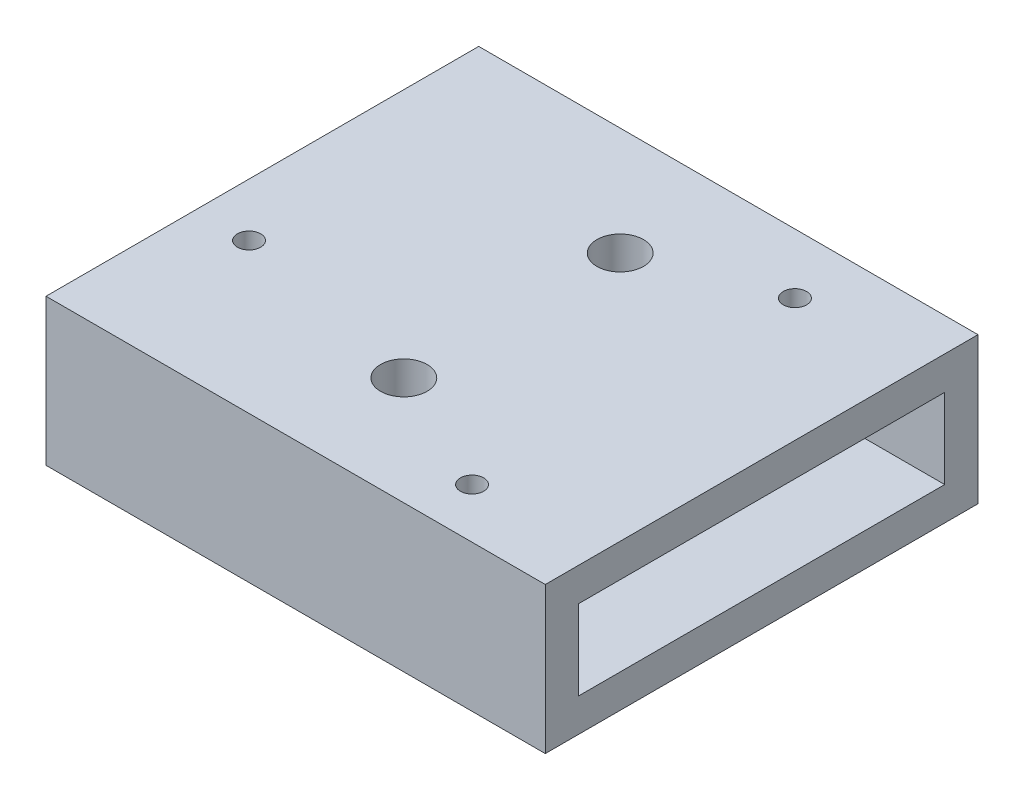
ISO-10303-21;
HEADER;
FILE_DESCRIPTION(('STEP AP214'),'2;1');
FILE_NAME('part.step','',(''),(''),'','','');
FILE_SCHEMA(('AUTOMOTIVE_DESIGN { 1 0 10303 214 1 1 1 1 }'));
ENDSEC;
DATA;
#1=APPLICATION_CONTEXT('core data for automotive mechanical design processes');
#2=APPLICATION_PROTOCOL_DEFINITION('international standard','automotive_design',2000,#1);
#3=PRODUCT_CONTEXT('',#1,'mechanical');
#4=PRODUCT('Part','Part','',(#3));
#5=PRODUCT_RELATED_PRODUCT_CATEGORY('part','',(#4));
#6=PRODUCT_DEFINITION_FORMATION('','',#4);
#7=PRODUCT_DEFINITION_CONTEXT('part definition',#1,'design');
#8=PRODUCT_DEFINITION('design','',#6,#7);
#9=PRODUCT_DEFINITION_SHAPE('','',#8);
#10=(LENGTH_UNIT() NAMED_UNIT(*) SI_UNIT(.MILLI.,.METRE.));
#11=(NAMED_UNIT(*) PLANE_ANGLE_UNIT() SI_UNIT($,.RADIAN.));
#12=(NAMED_UNIT(*) SI_UNIT($,.STERADIAN.) SOLID_ANGLE_UNIT());
#13=UNCERTAINTY_MEASURE_WITH_UNIT(LENGTH_MEASURE(1.E-05),#10,'distance_accuracy_value','');
#14=(GEOMETRIC_REPRESENTATION_CONTEXT(3) GLOBAL_UNCERTAINTY_ASSIGNED_CONTEXT((#13)) GLOBAL_UNIT_ASSIGNED_CONTEXT((#10,
#11,#12)) REPRESENTATION_CONTEXT('',''));
#15=CARTESIAN_POINT('',(0.,0.,0.));
#16=DIRECTION('',(0.,0.,1.));
#17=DIRECTION('',(1.,0.,0.));
#18=AXIS2_PLACEMENT_3D('',#15,#16,#17);
#19=CARTESIAN_POINT('',(-32.5,0.,0.));
#20=DIRECTION('',(1.,0.,0.));
#21=DIRECTION('',(0.,0.,-1.));
#22=AXIS2_PLACEMENT_3D('',#19,#20,#21);
#23=PLANE('',#22);
#24=DIRECTION('',(0.,-1.,0.));
#25=VECTOR('',#24,1.);
#26=CARTESIAN_POINT('',(-32.5,0.,-9.5));
#27=LINE('',#26,#25);
#28=CARTESIAN_POINT('',(-32.5,17.,-9.5));
#29=VERTEX_POINT('',#28);
#30=CARTESIAN_POINT('',(-32.5,5.,-9.5));
#31=VERTEX_POINT('',#30);
#32=EDGE_CURVE('E11',#29,#31,#27,.T.);
#33=ORIENTED_EDGE('',*,*,#32,.F.);
#34=DIRECTION('',(0.,0.,1.));
#35=VECTOR('',#34,1.);
#36=CARTESIAN_POINT('',(-32.5,17.,27.5));
#37=LINE('',#36,#35);
#38=CARTESIAN_POINT('',(-32.5,17.,27.5));
#39=VERTEX_POINT('',#38);
#40=EDGE_CURVE('E174',#29,#39,#37,.T.);
#41=ORIENTED_EDGE('',*,*,#40,.T.);
#42=DIRECTION('',(0.,-1.,0.));
#43=VECTOR('',#42,1.);
#44=CARTESIAN_POINT('',(-32.5,17.,27.5));
#45=LINE('',#44,#43);
#46=CARTESIAN_POINT('',(-32.5,5.,27.5));
#47=VERTEX_POINT('',#46);
#48=EDGE_CURVE('E179',#39,#47,#45,.T.);
#49=ORIENTED_EDGE('',*,*,#48,.T.);
#50=DIRECTION('',(0.,0.,-1.));
#51=VECTOR('',#50,1.);
#52=CARTESIAN_POINT('',(-32.5,5.,27.5));
#53=LINE('',#52,#51);
#54=EDGE_CURVE('E184',#47,#31,#53,.T.);
#55=ORIENTED_EDGE('',*,*,#54,.T.);
#56=EDGE_LOOP('',(#33,#41,#49,#55));
#57=FACE_BOUND('',#56,.T.);
#58=ADVANCED_FACE('F45',(#57),#23,.T.);
#59=CARTESIAN_POINT('',(-37.5,22.,-32.5));
#60=DIRECTION('',(1.,0.,0.));
#61=DIRECTION('',(0.,0.,-1.));
#62=AXIS2_PLACEMENT_3D('',#59,#60,#61);
#63=PLANE('',#62);
#64=DIRECTION('',(0.,0.,-1.));
#65=VECTOR('',#64,1.);
#66=CARTESIAN_POINT('',(-37.5,17.,-24.5));
#67=LINE('',#66,#65);
#68=CARTESIAN_POINT('',(-37.5,17.,-9.5));
#69=VERTEX_POINT('',#68);
#70=CARTESIAN_POINT('',(-37.5,17.,-24.5));
#71=VERTEX_POINT('',#70);
#72=EDGE_CURVE('E147',#69,#71,#67,.T.);
#73=ORIENTED_EDGE('',*,*,#72,.F.);
#74=DIRECTION('',(0.,1.,0.));
#75=VECTOR('',#74,1.);
#76=CARTESIAN_POINT('',(-37.5,17.,-9.5));
#77=LINE('',#76,#75);
#78=CARTESIAN_POINT('',(-37.5,5.,-9.5));
#79=VERTEX_POINT('',#78);
#80=EDGE_CURVE('E63',#79,#69,#77,.T.);
#81=ORIENTED_EDGE('',*,*,#80,.F.);
#82=DIRECTION('',(0.,0.,1.));
#83=VECTOR('',#82,1.);
#84=CARTESIAN_POINT('',(-37.5,5.,-24.5));
#85=LINE('',#84,#83);
#86=CARTESIAN_POINT('',(-37.5,5.,-24.5));
#87=VERTEX_POINT('',#86);
#88=EDGE_CURVE('E155',#87,#79,#85,.T.);
#89=ORIENTED_EDGE('',*,*,#88,.F.);
#90=DIRECTION('',(0.,-1.,0.));
#91=VECTOR('',#90,1.);
#92=CARTESIAN_POINT('',(-37.5,17.,-24.5));
#93=LINE('',#92,#91);
#94=EDGE_CURVE('E138',#71,#87,#93,.T.);
#95=ORIENTED_EDGE('',*,*,#94,.F.);
#96=EDGE_LOOP('',(#73,#81,#89,#95));
#97=FACE_BOUND('',#96,.T.);
#98=DIRECTION('',(0.,0.,1.));
#99=VECTOR('',#98,1.);
#100=CARTESIAN_POINT('',(-37.5,0.,-32.5));
#101=LINE('',#100,#99);
#102=CARTESIAN_POINT('',(-37.5,0.,-32.5));
#103=VERTEX_POINT('',#102);
#104=CARTESIAN_POINT('',(-37.5,0.,32.5));
#105=VERTEX_POINT('',#104);
#106=EDGE_CURVE('E204',#103,#105,#101,.T.);
#107=ORIENTED_EDGE('',*,*,#106,.T.);
#108=DIRECTION('',(0.,-1.,0.));
#109=VECTOR('',#108,1.);
#110=CARTESIAN_POINT('',(-37.5,22.,32.5));
#111=LINE('',#110,#109);
#112=CARTESIAN_POINT('',(-37.5,22.,32.5));
#113=VERTEX_POINT('',#112);
#114=EDGE_CURVE('E252',#113,#105,#111,.T.);
#115=ORIENTED_EDGE('',*,*,#114,.F.);
#116=DIRECTION('',(0.,0.,1.));
#117=VECTOR('',#116,1.);
#118=CARTESIAN_POINT('',(-37.5,22.,-32.5));
#119=LINE('',#118,#117);
#120=CARTESIAN_POINT('',(-37.5,22.,-32.5));
#121=VERTEX_POINT('',#120);
#122=EDGE_CURVE('E215',#121,#113,#119,.T.);
#123=ORIENTED_EDGE('',*,*,#122,.F.);
#124=DIRECTION('',(0.,-1.,0.));
#125=VECTOR('',#124,1.);
#126=CARTESIAN_POINT('',(-37.5,22.,-32.5));
#127=LINE('',#126,#125);
#128=EDGE_CURVE('E229',#121,#103,#127,.T.);
#129=ORIENTED_EDGE('',*,*,#128,.T.);
#130=EDGE_LOOP('',(#107,#115,#123,#129));
#131=FACE_BOUND('',#130,.T.);
#132=ADVANCED_FACE('F47',(#97,#131),#63,.F.);
#133=CARTESIAN_POINT('',(37.5,22.,32.5));
#134=DIRECTION('',(0.,0.,-1.));
#135=DIRECTION('',(-1.,0.,0.));
#136=AXIS2_PLACEMENT_3D('',#133,#134,#135);
#137=PLANE('',#136);
#138=DIRECTION('',(1.,0.,0.));
#139=VECTOR('',#138,1.);
#140=CARTESIAN_POINT('',(37.5,0.,32.5));
#141=LINE('',#140,#139);
#142=CARTESIAN_POINT('',(37.5,0.,32.5));
#143=VERTEX_POINT('',#142);
#144=EDGE_CURVE('E233',#105,#143,#141,.T.);
#145=ORIENTED_EDGE('',*,*,#144,.T.);
#146=DIRECTION('',(0.,-1.,0.));
#147=VECTOR('',#146,1.);
#148=CARTESIAN_POINT('',(37.5,22.,32.5));
#149=LINE('',#148,#147);
#150=CARTESIAN_POINT('',(37.5,22.,32.5));
#151=VERTEX_POINT('',#150);
#152=EDGE_CURVE('E248',#151,#143,#149,.T.);
#153=ORIENTED_EDGE('',*,*,#152,.F.);
#154=DIRECTION('',(1.,0.,0.));
#155=VECTOR('',#154,1.);
#156=CARTESIAN_POINT('',(37.5,22.,32.5));
#157=LINE('',#156,#155);
#158=EDGE_CURVE('E219',#113,#151,#157,.T.);
#159=ORIENTED_EDGE('',*,*,#158,.F.);
#160=ORIENTED_EDGE('',*,*,#114,.T.);
#161=EDGE_LOOP('',(#145,#153,#159,#160));
#162=FACE_BOUND('',#161,.T.);
#163=ADVANCED_FACE('F349',(#162),#137,.F.);
#164=CARTESIAN_POINT('',(37.5,22.,-32.5));
#165=DIRECTION('',(-1.,0.,0.));
#166=DIRECTION('',(0.,0.,1.));
#167=AXIS2_PLACEMENT_3D('',#164,#165,#166);
#168=PLANE('',#167);
#169=DIRECTION('',(0.,0.,1.));
#170=VECTOR('',#169,1.);
#171=CARTESIAN_POINT('',(37.5,17.,27.5));
#172=LINE('',#171,#170);
#173=CARTESIAN_POINT('',(37.5,17.,-27.5));
#174=VERTEX_POINT('',#173);
#175=CARTESIAN_POINT('',(37.5,17.,27.5));
#176=VERTEX_POINT('',#175);
#177=EDGE_CURVE('E191',#174,#176,#172,.T.);
#178=ORIENTED_EDGE('',*,*,#177,.F.);
#179=DIRECTION('',(0.,1.,0.));
#180=VECTOR('',#179,1.);
#181=CARTESIAN_POINT('',(37.5,17.,-27.5));
#182=LINE('',#181,#180);
#183=CARTESIAN_POINT('',(37.5,5.,-27.5));
#184=VERTEX_POINT('',#183);
#185=EDGE_CURVE('E165',#184,#174,#182,.T.);
#186=ORIENTED_EDGE('',*,*,#185,.F.);
#187=DIRECTION('',(0.,0.,-1.));
#188=VECTOR('',#187,1.);
#189=CARTESIAN_POINT('',(37.5,5.,27.5));
#190=LINE('',#189,#188);
#191=CARTESIAN_POINT('',(37.5,5.,27.5));
#192=VERTEX_POINT('',#191);
#193=EDGE_CURVE('E175',#192,#184,#190,.T.);
#194=ORIENTED_EDGE('',*,*,#193,.F.);
#195=DIRECTION('',(0.,-1.,0.));
#196=VECTOR('',#195,1.);
#197=CARTESIAN_POINT('',(37.5,17.,27.5));
#198=LINE('',#197,#196);
#199=EDGE_CURVE('E194',#176,#192,#198,.T.);
#200=ORIENTED_EDGE('',*,*,#199,.F.);
#201=EDGE_LOOP('',(#178,#186,#194,#200));
#202=FACE_BOUND('',#201,.T.);
#203=DIRECTION('',(0.,0.,-1.));
#204=VECTOR('',#203,1.);
#205=CARTESIAN_POINT('',(37.5,0.,-32.5));
#206=LINE('',#205,#204);
#207=CARTESIAN_POINT('',(37.5,0.,-32.5));
#208=VERTEX_POINT('',#207);
#209=EDGE_CURVE('E236',#143,#208,#206,.T.);
#210=ORIENTED_EDGE('',*,*,#209,.T.);
#211=DIRECTION('',(0.,-1.,0.));
#212=VECTOR('',#211,1.);
#213=CARTESIAN_POINT('',(37.5,22.,-32.5));
#214=LINE('',#213,#212);
#215=CARTESIAN_POINT('',(37.5,22.,-32.5));
#216=VERTEX_POINT('',#215);
#217=EDGE_CURVE('E244',#216,#208,#214,.T.);
#218=ORIENTED_EDGE('',*,*,#217,.F.);
#219=DIRECTION('',(0.,0.,-1.));
#220=VECTOR('',#219,1.);
#221=CARTESIAN_POINT('',(37.5,22.,-32.5));
#222=LINE('',#221,#220);
#223=EDGE_CURVE('E223',#151,#216,#222,.T.);
#224=ORIENTED_EDGE('',*,*,#223,.F.);
#225=ORIENTED_EDGE('',*,*,#152,.T.);
#226=EDGE_LOOP('',(#210,#218,#224,#225));
#227=FACE_BOUND('',#226,.T.);
#228=ADVANCED_FACE('F380',(#202,#227),#168,.F.);
#229=CARTESIAN_POINT('',(37.5,22.,-32.5));
#230=DIRECTION('',(0.,0.,1.));
#231=DIRECTION('',(1.,0.,0.));
#232=AXIS2_PLACEMENT_3D('',#229,#230,#231);
#233=PLANE('',#232);
#234=DIRECTION('',(-1.,0.,0.));
#235=VECTOR('',#234,1.);
#236=CARTESIAN_POINT('',(37.5,0.,-32.5));
#237=LINE('',#236,#235);
#238=EDGE_CURVE('E220',#208,#103,#237,.T.);
#239=ORIENTED_EDGE('',*,*,#238,.T.);
#240=ORIENTED_EDGE('',*,*,#128,.F.);
#241=DIRECTION('',(-1.,0.,0.));
#242=VECTOR('',#241,1.);
#243=CARTESIAN_POINT('',(37.5,22.,-32.5));
#244=LINE('',#243,#242);
#245=EDGE_CURVE('E226',#216,#121,#244,.T.);
#246=ORIENTED_EDGE('',*,*,#245,.F.);
#247=ORIENTED_EDGE('',*,*,#217,.T.);
#248=EDGE_LOOP('',(#239,#240,#246,#247));
#249=FACE_BOUND('',#248,.T.);
#250=ADVANCED_FACE('F383',(#249),#233,.F.);
#251=CARTESIAN_POINT('',(0.,22.,0.));
#252=DIRECTION('',(0.,-1.,0.));
#253=DIRECTION('',(0.,0.,-1.));
#254=AXIS2_PLACEMENT_3D('',#251,#252,#253);
#255=PLANE('',#254);
#256=CARTESIAN_POINT('',(0.,22.,-16.25));
#257=DIRECTION('',(0.,1.,0.));
#258=DIRECTION('',(0.,0.,1.));
#259=AXIS2_PLACEMENT_3D('',#256,#257,#258);
#260=CIRCLE('',#259,3.5);
#261=CARTESIAN_POINT('',(0.,22.,-12.75));
#262=VERTEX_POINT('',#261);
#263=EDGE_CURVE('E292',#262,#262,#260,.T.);
#264=ORIENTED_EDGE('',*,*,#263,.F.);
#265=EDGE_LOOP('',(#264));
#266=FACE_BOUND('',#265,.T.);
#267=CARTESIAN_POINT('',(0.,22.,16.25));
#268=DIRECTION('',(0.,1.,0.));
#269=DIRECTION('',(0.,0.,1.));
#270=AXIS2_PLACEMENT_3D('',#267,#268,#269);
#271=CIRCLE('',#270,3.5);
#272=CARTESIAN_POINT('',(0.,22.,19.75));
#273=VERTEX_POINT('',#272);
#274=EDGE_CURVE('E279',#273,#273,#271,.T.);
#275=ORIENTED_EDGE('',*,*,#274,.F.);
#276=EDGE_LOOP('',(#275));
#277=FACE_BOUND('',#276,.T.);
#278=CARTESIAN_POINT('',(-29.5,22.,10.));
#279=DIRECTION('',(0.,1.,0.));
#280=DIRECTION('',(0.,0.,1.));
#281=AXIS2_PLACEMENT_3D('',#278,#279,#280);
#282=CIRCLE('',#281,1.75);
#283=CARTESIAN_POINT('',(-29.5,22.,11.75));
#284=VERTEX_POINT('',#283);
#285=EDGE_CURVE('E278',#284,#284,#282,.T.);
#286=ORIENTED_EDGE('',*,*,#285,.F.);
#287=EDGE_LOOP('',(#286));
#288=FACE_BOUND('',#287,.T.);
#289=CARTESIAN_POINT('',(19.,22.,-23.5));
#290=DIRECTION('',(0.,1.,0.));
#291=DIRECTION('',(0.,0.,1.));
#292=AXIS2_PLACEMENT_3D('',#289,#290,#291);
#293=CIRCLE('',#292,1.75);
#294=CARTESIAN_POINT('',(19.,22.,-21.75));
#295=VERTEX_POINT('',#294);
#296=EDGE_CURVE('E301',#295,#295,#293,.T.);
#297=ORIENTED_EDGE('',*,*,#296,.F.);
#298=EDGE_LOOP('',(#297));
#299=FACE_BOUND('',#298,.T.);
#300=CARTESIAN_POINT('',(19.,22.,25.));
#301=DIRECTION('',(0.,1.,0.));
#302=DIRECTION('',(0.,0.,1.));
#303=AXIS2_PLACEMENT_3D('',#300,#301,#302);
#304=CIRCLE('',#303,1.75);
#305=CARTESIAN_POINT('',(19.,22.,26.75));
#306=VERTEX_POINT('',#305);
#307=EDGE_CURVE('E311',#306,#306,#304,.T.);
#308=ORIENTED_EDGE('',*,*,#307,.F.);
#309=EDGE_LOOP('',(#308));
#310=FACE_BOUND('',#309,.T.);
#311=ORIENTED_EDGE('',*,*,#122,.T.);
#312=ORIENTED_EDGE('',*,*,#158,.T.);
#313=ORIENTED_EDGE('',*,*,#223,.T.);
#314=ORIENTED_EDGE('',*,*,#245,.T.);
#315=EDGE_LOOP('',(#311,#312,#313,#314));
#316=FACE_BOUND('',#315,.T.);
#317=ADVANCED_FACE('F399',(#266,#277,#288,#299,#310,#316),#255,.F.);
#318=CARTESIAN_POINT('',(0.,0.,0.));
#319=DIRECTION('',(0.,-1.,0.));
#320=DIRECTION('',(0.,0.,-1.));
#321=AXIS2_PLACEMENT_3D('',#318,#319,#320);
#322=PLANE('',#321);
#323=CARTESIAN_POINT('',(-29.5,0.,10.));
#324=DIRECTION('',(0.,1.,0.));
#325=DIRECTION('',(0.,0.,1.));
#326=AXIS2_PLACEMENT_3D('',#323,#324,#325);
#327=CIRCLE('',#326,1.75);
#328=CARTESIAN_POINT('',(-29.5,0.,11.75));
#329=VERTEX_POINT('',#328);
#330=EDGE_CURVE('E274',#329,#329,#327,.T.);
#331=ORIENTED_EDGE('',*,*,#330,.T.);
#332=EDGE_LOOP('',(#331));
#333=FACE_BOUND('',#332,.T.);
#334=CARTESIAN_POINT('',(19.,0.,-23.5));
#335=DIRECTION('',(0.,1.,0.));
#336=DIRECTION('',(0.,0.,1.));
#337=AXIS2_PLACEMENT_3D('',#334,#335,#336);
#338=CIRCLE('',#337,1.75);
#339=CARTESIAN_POINT('',(19.,0.,-21.75));
#340=VERTEX_POINT('',#339);
#341=EDGE_CURVE('E269',#340,#340,#338,.T.);
#342=ORIENTED_EDGE('',*,*,#341,.T.);
#343=EDGE_LOOP('',(#342));
#344=FACE_BOUND('',#343,.T.);
#345=CARTESIAN_POINT('',(19.,0.,25.));
#346=DIRECTION('',(0.,1.,0.));
#347=DIRECTION('',(0.,0.,1.));
#348=AXIS2_PLACEMENT_3D('',#345,#346,#347);
#349=CIRCLE('',#348,1.75);
#350=CARTESIAN_POINT('',(19.,0.,26.75));
#351=VERTEX_POINT('',#350);
#352=EDGE_CURVE('E263',#351,#351,#349,.T.);
#353=ORIENTED_EDGE('',*,*,#352,.T.);
#354=EDGE_LOOP('',(#353));
#355=FACE_BOUND('',#354,.T.);
#356=ORIENTED_EDGE('',*,*,#106,.F.);
#357=ORIENTED_EDGE('',*,*,#238,.F.);
#358=ORIENTED_EDGE('',*,*,#209,.F.);
#359=ORIENTED_EDGE('',*,*,#144,.F.);
#360=EDGE_LOOP('',(#356,#357,#358,#359));
#361=FACE_BOUND('',#360,.T.);
#362=ADVANCED_FACE('F395',(#333,#344,#355,#361),#322,.T.);
#363=CARTESIAN_POINT('',(-32.5,17.,-27.5));
#364=DIRECTION('',(0.,0.,-1.));
#365=DIRECTION('',(-1.,0.,0.));
#366=AXIS2_PLACEMENT_3D('',#363,#364,#365);
#367=PLANE('',#366);
#368=ORIENTED_EDGE('',*,*,#185,.T.);
#369=DIRECTION('',(1.,0.,0.));
#370=VECTOR('',#369,1.);
#371=CARTESIAN_POINT('',(-32.5,17.,-27.5));
#372=LINE('',#371,#370);
#373=CARTESIAN_POINT('',(-32.5,17.,-27.5));
#374=VERTEX_POINT('',#373);
#375=EDGE_CURVE('E188',#374,#174,#372,.T.);
#376=ORIENTED_EDGE('',*,*,#375,.F.);
#377=DIRECTION('',(0.,1.,0.));
#378=VECTOR('',#377,1.);
#379=CARTESIAN_POINT('',(-32.5,17.,-27.5));
#380=LINE('',#379,#378);
#381=CARTESIAN_POINT('',(-32.5,5.,-27.5));
#382=VERTEX_POINT('',#381);
#383=EDGE_CURVE('E170',#382,#374,#380,.T.);
#384=ORIENTED_EDGE('',*,*,#383,.F.);
#385=DIRECTION('',(1.,0.,0.));
#386=VECTOR('',#385,1.);
#387=CARTESIAN_POINT('',(-32.5,5.,-27.5));
#388=LINE('',#387,#386);
#389=EDGE_CURVE('E200',#382,#184,#388,.T.);
#390=ORIENTED_EDGE('',*,*,#389,.T.);
#391=EDGE_LOOP('',(#368,#376,#384,#390));
#392=FACE_BOUND('',#391,.T.);
#393=ADVANCED_FACE('F379',(#392),#367,.F.);
#394=CARTESIAN_POINT('',(-32.5,5.,27.5));
#395=DIRECTION('',(0.,-1.,0.));
#396=DIRECTION('',(0.,0.,-1.));
#397=AXIS2_PLACEMENT_3D('',#394,#395,#396);
#398=PLANE('',#397);
#399=CARTESIAN_POINT('',(-29.5,5.,10.));
#400=DIRECTION('',(0.,-1.,0.));
#401=DIRECTION('',(0.,0.,-1.));
#402=AXIS2_PLACEMENT_3D('',#399,#400,#401);
#403=CIRCLE('',#402,1.75);
#404=CARTESIAN_POINT('',(-29.5,5.,8.25));
#405=VERTEX_POINT('',#404);
#406=EDGE_CURVE('E273',#405,#405,#403,.T.);
#407=ORIENTED_EDGE('',*,*,#406,.T.);
#408=EDGE_LOOP('',(#407));
#409=FACE_BOUND('',#408,.T.);
#410=CARTESIAN_POINT('',(19.,5.,-23.5));
#411=DIRECTION('',(0.,-1.,0.));
#412=DIRECTION('',(0.,0.,-1.));
#413=AXIS2_PLACEMENT_3D('',#410,#411,#412);
#414=CIRCLE('',#413,1.75);
#415=CARTESIAN_POINT('',(19.,5.,-25.25));
#416=VERTEX_POINT('',#415);
#417=EDGE_CURVE('E268',#416,#416,#414,.T.);
#418=ORIENTED_EDGE('',*,*,#417,.T.);
#419=EDGE_LOOP('',(#418));
#420=FACE_BOUND('',#419,.T.);
#421=CARTESIAN_POINT('',(19.,5.,25.));
#422=DIRECTION('',(0.,-1.,0.));
#423=DIRECTION('',(0.,0.,-1.));
#424=AXIS2_PLACEMENT_3D('',#421,#422,#423);
#425=CIRCLE('',#424,1.75);
#426=CARTESIAN_POINT('',(19.,5.,23.25));
#427=VERTEX_POINT('',#426);
#428=EDGE_CURVE('E262',#427,#427,#425,.T.);
#429=ORIENTED_EDGE('',*,*,#428,.T.);
#430=EDGE_LOOP('',(#429));
#431=FACE_BOUND('',#430,.T.);
#432=CARTESIAN_POINT('',(-32.5,5.,-24.5));
#433=VERTEX_POINT('',#432);
#434=EDGE_CURVE('E183',#433,#382,#53,.T.);
#435=ORIENTED_EDGE('',*,*,#434,.F.);
#436=DIRECTION('',(-1.,0.,0.));
#437=VECTOR('',#436,1.);
#438=CARTESIAN_POINT('',(37.5,5.,-24.5));
#439=LINE('',#438,#437);
#440=EDGE_CURVE('E143',#433,#87,#439,.T.);
#441=ORIENTED_EDGE('',*,*,#440,.T.);
#442=ORIENTED_EDGE('',*,*,#88,.T.);
#443=DIRECTION('',(-1.,0.,0.));
#444=VECTOR('',#443,1.);
#445=CARTESIAN_POINT('',(37.5,5.,-9.5));
#446=LINE('',#445,#444);
#447=EDGE_CURVE('E162',#31,#79,#446,.T.);
#448=ORIENTED_EDGE('',*,*,#447,.F.);
#449=ORIENTED_EDGE('',*,*,#54,.F.);
#450=DIRECTION('',(1.,0.,0.));
#451=VECTOR('',#450,1.);
#452=CARTESIAN_POINT('',(-32.5,5.,27.5));
#453=LINE('',#452,#451);
#454=EDGE_CURVE('E205',#47,#192,#453,.T.);
#455=ORIENTED_EDGE('',*,*,#454,.T.);
#456=ORIENTED_EDGE('',*,*,#193,.T.);
#457=ORIENTED_EDGE('',*,*,#389,.F.);
#458=EDGE_LOOP('',(#435,#441,#442,#448,#449,#455,#456,#457));
#459=FACE_BOUND('',#458,.T.);
#460=ADVANCED_FACE('F323',(#409,#420,#431,#459),#398,.F.);
#461=CARTESIAN_POINT('',(-32.5,17.,27.5));
#462=DIRECTION('',(0.,0.,1.));
#463=DIRECTION('',(1.,0.,0.));
#464=AXIS2_PLACEMENT_3D('',#461,#462,#463);
#465=PLANE('',#464);
#466=ORIENTED_EDGE('',*,*,#199,.T.);
#467=ORIENTED_EDGE('',*,*,#454,.F.);
#468=ORIENTED_EDGE('',*,*,#48,.F.);
#469=DIRECTION('',(1.,0.,0.));
#470=VECTOR('',#469,1.);
#471=CARTESIAN_POINT('',(-32.5,17.,27.5));
#472=LINE('',#471,#470);
#473=EDGE_CURVE('E208',#39,#176,#472,.T.);
#474=ORIENTED_EDGE('',*,*,#473,.T.);
#475=EDGE_LOOP('',(#466,#467,#468,#474));
#476=FACE_BOUND('',#475,.T.);
#477=ADVANCED_FACE('F360',(#476),#465,.F.);
#478=CARTESIAN_POINT('',(-32.5,17.,27.5));
#479=DIRECTION('',(0.,1.,0.));
#480=DIRECTION('',(0.,0.,1.));
#481=AXIS2_PLACEMENT_3D('',#478,#479,#480);
#482=PLANE('',#481);
#483=CARTESIAN_POINT('',(0.,17.,-16.25));
#484=DIRECTION('',(0.,1.,0.));
#485=DIRECTION('',(0.,0.,1.));
#486=AXIS2_PLACEMENT_3D('',#483,#484,#485);
#487=CIRCLE('',#486,3.5);
#488=CARTESIAN_POINT('',(0.,17.,-12.75));
#489=VERTEX_POINT('',#488);
#490=EDGE_CURVE('E49',#489,#489,#487,.T.);
#491=ORIENTED_EDGE('',*,*,#490,.T.);
#492=EDGE_LOOP('',(#491));
#493=FACE_BOUND('',#492,.T.);
#494=CARTESIAN_POINT('',(0.,17.,16.25));
#495=DIRECTION('',(0.,1.,0.));
#496=DIRECTION('',(0.,0.,1.));
#497=AXIS2_PLACEMENT_3D('',#494,#495,#496);
#498=CIRCLE('',#497,3.5);
#499=CARTESIAN_POINT('',(0.,17.,19.75));
#500=VERTEX_POINT('',#499);
#501=EDGE_CURVE('E275',#500,#500,#498,.T.);
#502=ORIENTED_EDGE('',*,*,#501,.T.);
#503=EDGE_LOOP('',(#502));
#504=FACE_BOUND('',#503,.T.);
#505=CARTESIAN_POINT('',(-29.5,17.,10.));
#506=DIRECTION('',(0.,1.,0.));
#507=DIRECTION('',(0.,0.,1.));
#508=AXIS2_PLACEMENT_3D('',#505,#506,#507);
#509=CIRCLE('',#508,1.75);
#510=CARTESIAN_POINT('',(-29.5,17.,11.75));
#511=VERTEX_POINT('',#510);
#512=EDGE_CURVE('E270',#511,#511,#509,.T.);
#513=ORIENTED_EDGE('',*,*,#512,.T.);
#514=EDGE_LOOP('',(#513));
#515=FACE_BOUND('',#514,.T.);
#516=CARTESIAN_POINT('',(19.,17.,-23.5));
#517=DIRECTION('',(0.,1.,0.));
#518=DIRECTION('',(0.,0.,1.));
#519=AXIS2_PLACEMENT_3D('',#516,#517,#518);
#520=CIRCLE('',#519,1.75);
#521=CARTESIAN_POINT('',(19.,17.,-21.75));
#522=VERTEX_POINT('',#521);
#523=EDGE_CURVE('E264',#522,#522,#520,.T.);
#524=ORIENTED_EDGE('',*,*,#523,.T.);
#525=EDGE_LOOP('',(#524));
#526=FACE_BOUND('',#525,.T.);
#527=CARTESIAN_POINT('',(19.,17.,25.));
#528=DIRECTION('',(0.,1.,0.));
#529=DIRECTION('',(0.,0.,1.));
#530=AXIS2_PLACEMENT_3D('',#527,#528,#529);
#531=CIRCLE('',#530,1.75);
#532=CARTESIAN_POINT('',(19.,17.,26.75));
#533=VERTEX_POINT('',#532);
#534=EDGE_CURVE('E258',#533,#533,#531,.T.);
#535=ORIENTED_EDGE('',*,*,#534,.T.);
#536=EDGE_LOOP('',(#535));
#537=FACE_BOUND('',#536,.T.);
#538=ORIENTED_EDGE('',*,*,#177,.T.);
#539=ORIENTED_EDGE('',*,*,#473,.F.);
#540=ORIENTED_EDGE('',*,*,#40,.F.);
#541=DIRECTION('',(-1.,0.,0.));
#542=VECTOR('',#541,1.);
#543=CARTESIAN_POINT('',(37.5,17.,-9.5));
#544=LINE('',#543,#542);
#545=EDGE_CURVE('E144',#29,#69,#544,.T.);
#546=ORIENTED_EDGE('',*,*,#545,.T.);
#547=ORIENTED_EDGE('',*,*,#72,.T.);
#548=DIRECTION('',(-1.,0.,0.));
#549=VECTOR('',#548,1.);
#550=CARTESIAN_POINT('',(37.5,17.,-24.5));
#551=LINE('',#550,#549);
#552=CARTESIAN_POINT('',(-32.5,17.,-24.5));
#553=VERTEX_POINT('',#552);
#554=EDGE_CURVE('E71',#553,#71,#551,.T.);
#555=ORIENTED_EDGE('',*,*,#554,.F.);
#556=EDGE_CURVE('E176',#374,#553,#37,.T.);
#557=ORIENTED_EDGE('',*,*,#556,.F.);
#558=ORIENTED_EDGE('',*,*,#375,.T.);
#559=EDGE_LOOP('',(#538,#539,#540,#546,#547,#555,#557,#558));
#560=FACE_BOUND('',#559,.T.);
#561=ADVANCED_FACE('F148',(#493,#504,#515,#526,#537,#560),#482,.F.);
#562=DIRECTION('',(0.,1.,0.));
#563=VECTOR('',#562,1.);
#564=CARTESIAN_POINT('',(-32.5,0.,-24.5));
#565=LINE('',#564,#563);
#566=EDGE_CURVE('E55',#433,#553,#565,.T.);
#567=ORIENTED_EDGE('',*,*,#566,.F.);
#568=ORIENTED_EDGE('',*,*,#434,.T.);
#569=ORIENTED_EDGE('',*,*,#383,.T.);
#570=ORIENTED_EDGE('',*,*,#556,.T.);
#571=EDGE_LOOP('',(#567,#568,#569,#570));
#572=FACE_BOUND('',#571,.T.);
#573=ADVANCED_FACE('F345',(#572),#23,.T.);
#574=CARTESIAN_POINT('',(37.5,17.,-9.5));
#575=DIRECTION('',(0.,0.,1.));
#576=DIRECTION('',(0.,-1.,0.));
#577=AXIS2_PLACEMENT_3D('',#574,#575,#576);
#578=PLANE('',#577);
#579=ORIENTED_EDGE('',*,*,#32,.T.);
#580=ORIENTED_EDGE('',*,*,#447,.T.);
#581=ORIENTED_EDGE('',*,*,#80,.T.);
#582=ORIENTED_EDGE('',*,*,#545,.F.);
#583=EDGE_LOOP('',(#579,#580,#581,#582));
#584=FACE_BOUND('',#583,.T.);
#585=ADVANCED_FACE('F354',(#584),#578,.F.);
#586=CARTESIAN_POINT('',(37.5,17.,-24.5));
#587=DIRECTION('',(0.,0.,-1.));
#588=DIRECTION('',(-1.,0.,0.));
#589=AXIS2_PLACEMENT_3D('',#586,#587,#588);
#590=PLANE('',#589);
#591=ORIENTED_EDGE('',*,*,#566,.T.);
#592=ORIENTED_EDGE('',*,*,#554,.T.);
#593=ORIENTED_EDGE('',*,*,#94,.T.);
#594=ORIENTED_EDGE('',*,*,#440,.F.);
#595=EDGE_LOOP('',(#591,#592,#593,#594));
#596=FACE_BOUND('',#595,.T.);
#597=ADVANCED_FACE('F136',(#596),#590,.F.);
#598=CARTESIAN_POINT('',(19.,0.,25.));
#599=DIRECTION('',(0.,1.,0.));
#600=DIRECTION('',(0.,0.,1.));
#601=AXIS2_PLACEMENT_3D('',#598,#599,#600);
#602=CYLINDRICAL_SURFACE('',#601,1.75);
#603=ORIENTED_EDGE('',*,*,#307,.T.);
#604=EDGE_LOOP('',(#603));
#605=FACE_BOUND('',#604,.T.);
#606=ORIENTED_EDGE('',*,*,#534,.F.);
#607=EDGE_LOOP('',(#606));
#608=FACE_BOUND('',#607,.T.);
#609=ADVANCED_FACE('F329',(#605,#608),#602,.F.);
#610=ORIENTED_EDGE('',*,*,#352,.F.);
#611=EDGE_LOOP('',(#610));
#612=FACE_BOUND('',#611,.T.);
#613=ORIENTED_EDGE('',*,*,#428,.F.);
#614=EDGE_LOOP('',(#613));
#615=FACE_BOUND('',#614,.T.);
#616=ADVANCED_FACE('F326',(#612,#615),#602,.F.);
#617=CARTESIAN_POINT('',(19.,0.,-23.5));
#618=DIRECTION('',(0.,1.,0.));
#619=DIRECTION('',(0.,0.,1.));
#620=AXIS2_PLACEMENT_3D('',#617,#618,#619);
#621=CYLINDRICAL_SURFACE('',#620,1.75);
#622=ORIENTED_EDGE('',*,*,#296,.T.);
#623=EDGE_LOOP('',(#622));
#624=FACE_BOUND('',#623,.T.);
#625=ORIENTED_EDGE('',*,*,#523,.F.);
#626=EDGE_LOOP('',(#625));
#627=FACE_BOUND('',#626,.T.);
#628=ADVANCED_FACE('F328',(#624,#627),#621,.F.);
#629=ORIENTED_EDGE('',*,*,#341,.F.);
#630=EDGE_LOOP('',(#629));
#631=FACE_BOUND('',#630,.T.);
#632=ORIENTED_EDGE('',*,*,#417,.F.);
#633=EDGE_LOOP('',(#632));
#634=FACE_BOUND('',#633,.T.);
#635=ADVANCED_FACE('F336',(#631,#634),#621,.F.);
#636=CARTESIAN_POINT('',(-29.5,0.,10.));
#637=DIRECTION('',(0.,1.,0.));
#638=DIRECTION('',(0.,0.,1.));
#639=AXIS2_PLACEMENT_3D('',#636,#637,#638);
#640=CYLINDRICAL_SURFACE('',#639,1.75);
#641=ORIENTED_EDGE('',*,*,#285,.T.);
#642=EDGE_LOOP('',(#641));
#643=FACE_BOUND('',#642,.T.);
#644=ORIENTED_EDGE('',*,*,#512,.F.);
#645=EDGE_LOOP('',(#644));
#646=FACE_BOUND('',#645,.T.);
#647=ADVANCED_FACE('F425',(#643,#646),#640,.F.);
#648=ORIENTED_EDGE('',*,*,#330,.F.);
#649=EDGE_LOOP('',(#648));
#650=FACE_BOUND('',#649,.T.);
#651=ORIENTED_EDGE('',*,*,#406,.F.);
#652=EDGE_LOOP('',(#651));
#653=FACE_BOUND('',#652,.T.);
#654=ADVANCED_FACE('F430',(#650,#653),#640,.F.);
#655=CARTESIAN_POINT('',(0.,16.,16.25));
#656=DIRECTION('',(0.,1.,0.));
#657=DIRECTION('',(0.,0.,1.));
#658=AXIS2_PLACEMENT_3D('',#655,#656,#657);
#659=CYLINDRICAL_SURFACE('',#658,3.5);
#660=ORIENTED_EDGE('',*,*,#274,.T.);
#661=EDGE_LOOP('',(#660));
#662=FACE_BOUND('',#661,.T.);
#663=ORIENTED_EDGE('',*,*,#501,.F.);
#664=EDGE_LOOP('',(#663));
#665=FACE_BOUND('',#664,.T.);
#666=ADVANCED_FACE('F436',(#662,#665),#659,.F.);
#667=CARTESIAN_POINT('',(0.,16.,-16.25));
#668=DIRECTION('',(0.,1.,0.));
#669=DIRECTION('',(0.,0.,1.));
#670=AXIS2_PLACEMENT_3D('',#667,#668,#669);
#671=CYLINDRICAL_SURFACE('',#670,3.5);
#672=ORIENTED_EDGE('',*,*,#263,.T.);
#673=EDGE_LOOP('',(#672));
#674=FACE_BOUND('',#673,.T.);
#675=ORIENTED_EDGE('',*,*,#490,.F.);
#676=EDGE_LOOP('',(#675));
#677=FACE_BOUND('',#676,.T.);
#678=ADVANCED_FACE('F440',(#674,#677),#671,.F.);
#679=CLOSED_SHELL('',(#58,#132,#163,#228,#250,#317,#362,#393,#460,#477,#561,#573,#585,#597,#609,
#616,#628,#635,#647,#654,#666,#678));
#680=MANIFOLD_SOLID_BREP('B2',#679);
#681=ADVANCED_BREP_SHAPE_REPRESENTATION('',(#18,#680),#14);
#682=SHAPE_DEFINITION_REPRESENTATION(#9,#681);
ENDSEC;
END-ISO-10303-21;
